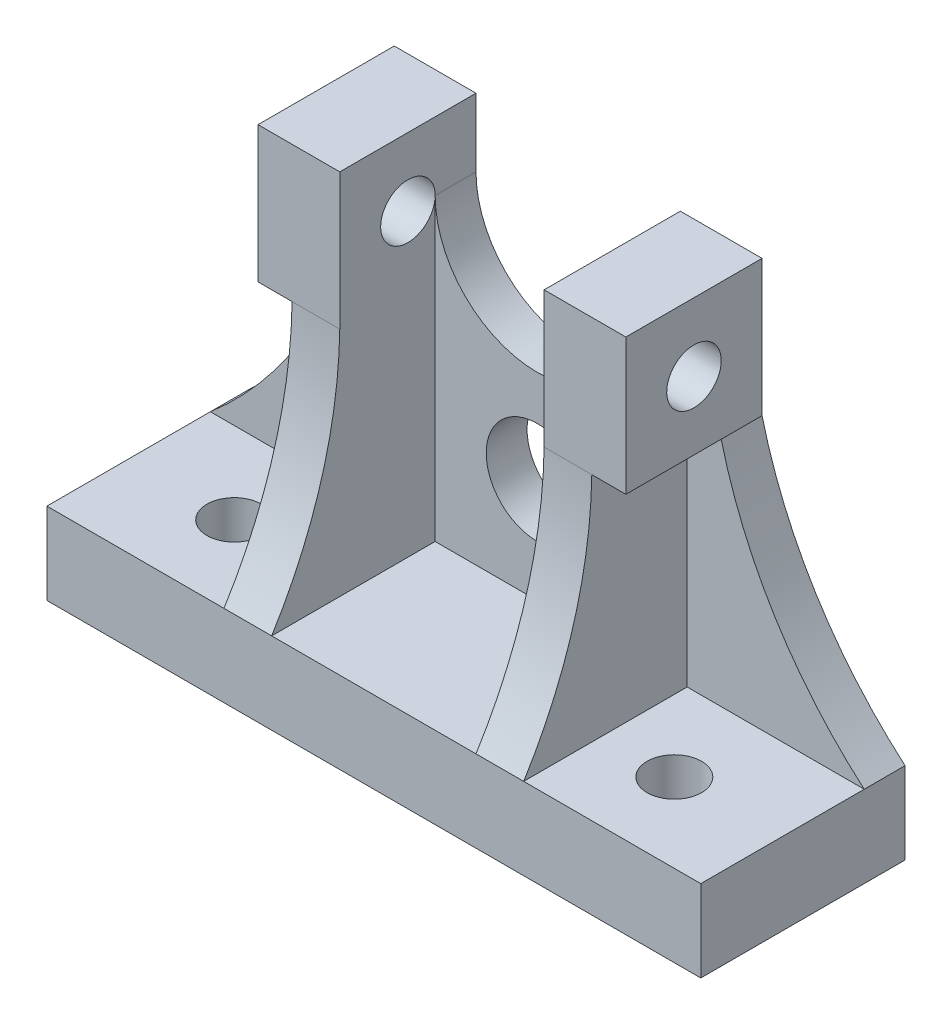
ISO-10303-21;
HEADER;
FILE_DESCRIPTION(('STEP AP214'),'2;1');
FILE_NAME('part.step','',(''),(''),'','','');
FILE_SCHEMA(('AUTOMOTIVE_DESIGN { 1 0 10303 214 1 1 1 1 }'));
ENDSEC;
DATA;
#1=APPLICATION_CONTEXT('core data for automotive mechanical design processes');
#2=APPLICATION_PROTOCOL_DEFINITION('international standard','automotive_design',2000,#1);
#3=PRODUCT_CONTEXT('',#1,'mechanical');
#4=PRODUCT('Part','Part','',(#3));
#5=PRODUCT_RELATED_PRODUCT_CATEGORY('part','',(#4));
#6=PRODUCT_DEFINITION_FORMATION('','',#4);
#7=PRODUCT_DEFINITION_CONTEXT('part definition',#1,'design');
#8=PRODUCT_DEFINITION('design','',#6,#7);
#9=PRODUCT_DEFINITION_SHAPE('','',#8);
#10=(LENGTH_UNIT() NAMED_UNIT(*) SI_UNIT(.MILLI.,.METRE.));
#11=(NAMED_UNIT(*) PLANE_ANGLE_UNIT() SI_UNIT($,.RADIAN.));
#12=(NAMED_UNIT(*) SI_UNIT($,.STERADIAN.) SOLID_ANGLE_UNIT());
#13=UNCERTAINTY_MEASURE_WITH_UNIT(LENGTH_MEASURE(1.E-05),#10,'distance_accuracy_value','');
#14=(GEOMETRIC_REPRESENTATION_CONTEXT(3) GLOBAL_UNCERTAINTY_ASSIGNED_CONTEXT((#13)) GLOBAL_UNIT_ASSIGNED_CONTEXT((#10,
#11,#12)) REPRESENTATION_CONTEXT('',''));
#15=CARTESIAN_POINT('',(0.,0.,0.));
#16=DIRECTION('',(0.,0.,1.));
#17=DIRECTION('',(1.,0.,0.));
#18=AXIS2_PLACEMENT_3D('',#15,#16,#17);
#19=CARTESIAN_POINT('',(0.,12.,30.));
#20=DIRECTION('',(0.,-1.,0.));
#21=DIRECTION('',(0.,0.,-1.));
#22=AXIS2_PLACEMENT_3D('',#19,#20,#21);
#23=PLANE('',#22);
#24=CARTESIAN_POINT('',(32.4988825502588,12.,18.3811393677707));
#25=DIRECTION('',(0.,1.,0.));
#26=DIRECTION('',(0.,0.,1.));
#27=AXIS2_PLACEMENT_3D('',#24,#25,#26);
#28=CIRCLE('',#27,3.99999999999999);
#29=CARTESIAN_POINT('',(32.4988825502588,12.,22.3811393677707));
#30=VERTEX_POINT('',#29);
#31=EDGE_CURVE('E526',#30,#30,#28,.T.);
#32=ORIENTED_EDGE('',*,*,#31,.F.);
#33=EDGE_LOOP('',(#32));
#34=FACE_BOUND('',#33,.T.);
#35=DIRECTION('',(0.,0.,-1.));
#36=VECTOR('',#35,1.);
#37=CARTESIAN_POINT('',(22.,12.,6.));
#38=LINE('',#37,#36);
#39=CARTESIAN_POINT('',(22.,12.,30.));
#40=VERTEX_POINT('',#39);
#41=CARTESIAN_POINT('',(22.,12.,6.));
#42=VERTEX_POINT('',#41);
#43=EDGE_CURVE('E69',#40,#42,#38,.T.);
#44=ORIENTED_EDGE('',*,*,#43,.F.);
#45=DIRECTION('',(-1.,0.,0.));
#46=VECTOR('',#45,1.);
#47=CARTESIAN_POINT('',(0.,12.,30.));
#48=LINE('',#47,#46);
#49=CARTESIAN_POINT('',(48.,12.,30.));
#50=VERTEX_POINT('',#49);
#51=EDGE_CURVE('E407',#50,#40,#48,.T.);
#52=ORIENTED_EDGE('',*,*,#51,.F.);
#53=DIRECTION('',(0.,0.,-1.));
#54=VECTOR('',#53,1.);
#55=CARTESIAN_POINT('',(48.,12.,30.));
#56=LINE('',#55,#54);
#57=CARTESIAN_POINT('',(48.,12.,6.));
#58=VERTEX_POINT('',#57);
#59=EDGE_CURVE('E422',#50,#58,#56,.T.);
#60=ORIENTED_EDGE('',*,*,#59,.T.);
#61=DIRECTION('',(-1.,0.,0.));
#62=VECTOR('',#61,1.);
#63=CARTESIAN_POINT('',(0.,12.,6.));
#64=LINE('',#63,#62);
#65=EDGE_CURVE('E355',#58,#42,#64,.T.);
#66=ORIENTED_EDGE('',*,*,#65,.T.);
#67=EDGE_LOOP('',(#44,#52,#60,#66));
#68=FACE_BOUND('',#67,.T.);
#69=ADVANCED_FACE('F45',(#34,#68),#23,.F.);
#70=CARTESIAN_POINT('',(0.,0.,6.));
#71=DIRECTION('',(0.,0.,1.));
#72=DIRECTION('',(1.,0.,0.));
#73=AXIS2_PLACEMENT_3D('',#70,#71,#72);
#74=PLANE('',#73);
#75=DIRECTION('',(-1.,0.,0.));
#76=VECTOR('',#75,1.);
#77=CARTESIAN_POINT('',(0.,46.,6.));
#78=LINE('',#77,#76);
#79=CARTESIAN_POINT('',(27.,46.,6.));
#80=VERTEX_POINT('',#79);
#81=CARTESIAN_POINT('',(22.,46.,6.));
#82=VERTEX_POINT('',#81);
#83=EDGE_CURVE('E363',#80,#82,#78,.T.);
#84=ORIENTED_EDGE('',*,*,#83,.T.);
#85=DIRECTION('',(0.,1.,0.));
#86=VECTOR('',#85,1.);
#87=CARTESIAN_POINT('',(22.,46.,6.));
#88=LINE('',#87,#86);
#89=EDGE_CURVE('E225',#42,#82,#88,.T.);
#90=ORIENTED_EDGE('',*,*,#89,.F.);
#91=ORIENTED_EDGE('',*,*,#65,.F.);
#92=CARTESIAN_POINT('',(91.0174934385468,62.054922417926,6.));
#93=DIRECTION('',(0.,0.,1.));
#94=DIRECTION('',(1.,0.,0.));
#95=AXIS2_PLACEMENT_3D('',#92,#93,#94);
#96=CIRCLE('',#95,66.);
#97=EDGE_CURVE('E358',#58,#80,#96,.F.);
#98=ORIENTED_EDGE('',*,*,#97,.T.);
#99=EDGE_LOOP('',(#84,#90,#91,#98));
#100=FACE_BOUND('',#99,.T.);
#101=ADVANCED_FACE('F549',(#100),#74,.T.);
#102=CARTESIAN_POINT('',(0.,46.,20.));
#103=DIRECTION('',(0.,-1.,0.));
#104=DIRECTION('',(0.,0.,-1.));
#105=AXIS2_PLACEMENT_3D('',#102,#103,#104);
#106=PLANE('',#105);
#107=DIRECTION('',(-1.,0.,0.));
#108=VECTOR('',#107,1.);
#109=CARTESIAN_POINT('',(0.,46.,20.));
#110=LINE('',#109,#108);
#111=CARTESIAN_POINT('',(27.,46.,20.));
#112=VERTEX_POINT('',#111);
#113=CARTESIAN_POINT('',(22.,46.,20.));
#114=VERTEX_POINT('',#113);
#115=EDGE_CURVE('E205',#112,#114,#110,.T.);
#116=ORIENTED_EDGE('',*,*,#115,.T.);
#117=DIRECTION('',(0.,0.,1.));
#118=VECTOR('',#117,1.);
#119=CARTESIAN_POINT('',(22.,46.,20.));
#120=LINE('',#119,#118);
#121=EDGE_CURVE('E237',#82,#114,#120,.T.);
#122=ORIENTED_EDGE('',*,*,#121,.F.);
#123=ORIENTED_EDGE('',*,*,#83,.F.);
#124=DIRECTION('',(0.,0.,-1.));
#125=VECTOR('',#124,1.);
#126=CARTESIAN_POINT('',(27.,46.,20.));
#127=LINE('',#126,#125);
#128=EDGE_CURVE('E292',#112,#80,#127,.T.);
#129=ORIENTED_EDGE('',*,*,#128,.F.);
#130=EDGE_LOOP('',(#116,#122,#123,#129));
#131=FACE_BOUND('',#130,.T.);
#132=ADVANCED_FACE('F542',(#131),#106,.T.);
#133=CARTESIAN_POINT('',(-32.5,12.,18.));
#134=DIRECTION('',(0.,1.,0.));
#135=DIRECTION('',(0.,0.,1.));
#136=AXIS2_PLACEMENT_3D('',#133,#134,#135);
#137=CIRCLE('',#136,3.99999999999999);
#138=CARTESIAN_POINT('',(-32.5,12.,22.));
#139=VERTEX_POINT('',#138);
#140=EDGE_CURVE('E534',#139,#139,#137,.T.);
#141=ORIENTED_EDGE('',*,*,#140,.F.);
#142=EDGE_LOOP('',(#141));
#143=FACE_BOUND('',#142,.T.);
#144=DIRECTION('',(0.,0.,-1.));
#145=VECTOR('',#144,1.);
#146=CARTESIAN_POINT('',(-22.,12.,6.));
#147=LINE('',#146,#145);
#148=CARTESIAN_POINT('',(-22.,12.,30.));
#149=VERTEX_POINT('',#148);
#150=CARTESIAN_POINT('',(-22.,12.,6.));
#151=VERTEX_POINT('',#150);
#152=EDGE_CURVE('E250',#149,#151,#147,.T.);
#153=ORIENTED_EDGE('',*,*,#152,.T.);
#154=CARTESIAN_POINT('',(-48.,12.,6.));
#155=VERTEX_POINT('',#154);
#156=EDGE_CURVE('E354',#151,#155,#64,.T.);
#157=ORIENTED_EDGE('',*,*,#156,.T.);
#158=DIRECTION('',(0.,0.,-1.));
#159=VECTOR('',#158,1.);
#160=CARTESIAN_POINT('',(-48.,12.,30.));
#161=LINE('',#160,#159);
#162=CARTESIAN_POINT('',(-48.,12.,30.));
#163=VERTEX_POINT('',#162);
#164=EDGE_CURVE('E11',#163,#155,#161,.T.);
#165=ORIENTED_EDGE('',*,*,#164,.F.);
#166=EDGE_CURVE('E411',#149,#163,#48,.T.);
#167=ORIENTED_EDGE('',*,*,#166,.F.);
#168=EDGE_LOOP('',(#153,#157,#165,#167));
#169=FACE_BOUND('',#168,.T.);
#170=ADVANCED_FACE('F466',(#143,#169),#23,.F.);
#171=ORIENTED_EDGE('',*,*,#156,.F.);
#172=DIRECTION('',(0.,1.,0.));
#173=VECTOR('',#172,1.);
#174=CARTESIAN_POINT('',(-22.,46.,6.));
#175=LINE('',#174,#173);
#176=CARTESIAN_POINT('',(-22.,46.,6.));
#177=VERTEX_POINT('',#176);
#178=EDGE_CURVE('E238',#151,#177,#175,.T.);
#179=ORIENTED_EDGE('',*,*,#178,.T.);
#180=DIRECTION('',(1.,0.,0.));
#181=VECTOR('',#180,1.);
#182=CARTESIAN_POINT('',(0.,46.,6.));
#183=LINE('',#182,#181);
#184=CARTESIAN_POINT('',(-27.,46.,6.));
#185=VERTEX_POINT('',#184);
#186=EDGE_CURVE('E346',#185,#177,#183,.T.);
#187=ORIENTED_EDGE('',*,*,#186,.F.);
#188=CARTESIAN_POINT('',(-91.0174934385468,62.0549224179259,6.));
#189=DIRECTION('',(0.,0.,1.));
#190=DIRECTION('',(1.,0.,0.));
#191=AXIS2_PLACEMENT_3D('',#188,#189,#190);
#192=CIRCLE('',#191,66.);
#193=EDGE_CURVE('E350',#155,#185,#192,.T.);
#194=ORIENTED_EDGE('',*,*,#193,.F.);
#195=EDGE_LOOP('',(#171,#179,#187,#194));
#196=FACE_BOUND('',#195,.T.);
#197=ADVANCED_FACE('F472',(#196),#74,.T.);
#198=CARTESIAN_POINT('',(0.,46.,20.));
#199=DIRECTION('',(0.,1.,0.));
#200=DIRECTION('',(0.,0.,1.));
#201=AXIS2_PLACEMENT_3D('',#198,#199,#200);
#202=PLANE('',#201);
#203=DIRECTION('',(0.,0.,1.));
#204=VECTOR('',#203,1.);
#205=CARTESIAN_POINT('',(-22.,46.,20.));
#206=LINE('',#205,#204);
#207=CARTESIAN_POINT('',(-22.,46.,20.));
#208=VERTEX_POINT('',#207);
#209=EDGE_CURVE('E242',#177,#208,#206,.T.);
#210=ORIENTED_EDGE('',*,*,#209,.T.);
#211=DIRECTION('',(1.,0.,0.));
#212=VECTOR('',#211,1.);
#213=CARTESIAN_POINT('',(0.,46.,20.));
#214=LINE('',#213,#212);
#215=CARTESIAN_POINT('',(-27.,46.,20.));
#216=VERTEX_POINT('',#215);
#217=EDGE_CURVE('E297',#216,#208,#214,.T.);
#218=ORIENTED_EDGE('',*,*,#217,.F.);
#219=DIRECTION('',(0.,0.,-1.));
#220=VECTOR('',#219,1.);
#221=CARTESIAN_POINT('',(-27.,46.,20.));
#222=LINE('',#221,#220);
#223=EDGE_CURVE('E312',#216,#185,#222,.T.);
#224=ORIENTED_EDGE('',*,*,#223,.T.);
#225=ORIENTED_EDGE('',*,*,#186,.T.);
#226=EDGE_LOOP('',(#210,#218,#224,#225));
#227=FACE_BOUND('',#226,.T.);
#228=ADVANCED_FACE('F547',(#227),#202,.F.);
#229=CARTESIAN_POINT('',(15.,12.,30.));
#230=VERTEX_POINT('',#229);
#231=CARTESIAN_POINT('',(-15.,12.,30.));
#232=VERTEX_POINT('',#231);
#233=EDGE_CURVE('E61',#230,#232,#48,.T.);
#234=ORIENTED_EDGE('',*,*,#233,.F.);
#235=DIRECTION('',(0.,0.,-1.));
#236=VECTOR('',#235,1.);
#237=CARTESIAN_POINT('',(15.,12.,6.));
#238=LINE('',#237,#236);
#239=CARTESIAN_POINT('',(15.,12.,6.));
#240=VERTEX_POINT('',#239);
#241=EDGE_CURVE('E223',#230,#240,#238,.T.);
#242=ORIENTED_EDGE('',*,*,#241,.T.);
#243=CARTESIAN_POINT('',(-15.,12.,6.));
#244=VERTEX_POINT('',#243);
#245=EDGE_CURVE('E359',#240,#244,#64,.T.);
#246=ORIENTED_EDGE('',*,*,#245,.T.);
#247=DIRECTION('',(0.,0.,-1.));
#248=VECTOR('',#247,1.);
#249=CARTESIAN_POINT('',(-15.,12.,6.));
#250=LINE('',#249,#248);
#251=EDGE_CURVE('E243',#232,#244,#250,.T.);
#252=ORIENTED_EDGE('',*,*,#251,.F.);
#253=EDGE_LOOP('',(#234,#242,#246,#252));
#254=FACE_BOUND('',#253,.T.);
#255=ADVANCED_FACE('F47',(#254),#23,.F.);
#256=CARTESIAN_POINT('',(-48.,0.,30.));
#257=DIRECTION('',(1.,0.,0.));
#258=DIRECTION('',(0.,0.,-1.));
#259=AXIS2_PLACEMENT_3D('',#256,#257,#258);
#260=PLANE('',#259);
#261=DIRECTION('',(0.,-1.,0.));
#262=VECTOR('',#261,1.);
#263=CARTESIAN_POINT('',(-48.,0.,0.));
#264=LINE('',#263,#262);
#265=CARTESIAN_POINT('',(-48.,12.,0.));
#266=VERTEX_POINT('',#265);
#267=CARTESIAN_POINT('',(-48.,0.,0.));
#268=VERTEX_POINT('',#267);
#269=EDGE_CURVE('E406',#266,#268,#264,.T.);
#270=ORIENTED_EDGE('',*,*,#269,.T.);
#271=DIRECTION('',(0.,0.,-1.));
#272=VECTOR('',#271,1.);
#273=CARTESIAN_POINT('',(-48.,0.,30.));
#274=LINE('',#273,#272);
#275=CARTESIAN_POINT('',(-48.,0.,30.));
#276=VERTEX_POINT('',#275);
#277=EDGE_CURVE('E54',#276,#268,#274,.T.);
#278=ORIENTED_EDGE('',*,*,#277,.F.);
#279=DIRECTION('',(0.,-1.,0.));
#280=VECTOR('',#279,1.);
#281=CARTESIAN_POINT('',(-48.,0.,30.));
#282=LINE('',#281,#280);
#283=EDGE_CURVE('E410',#163,#276,#282,.T.);
#284=ORIENTED_EDGE('',*,*,#283,.F.);
#285=ORIENTED_EDGE('',*,*,#164,.T.);
#286=DIRECTION('',(0.,0.,-1.));
#287=VECTOR('',#286,1.);
#288=CARTESIAN_POINT('',(-48.,12.,6.));
#289=LINE('',#288,#287);
#290=EDGE_CURVE('E395',#155,#266,#289,.T.);
#291=ORIENTED_EDGE('',*,*,#290,.T.);
#292=EDGE_LOOP('',(#270,#278,#284,#285,#291));
#293=FACE_BOUND('',#292,.T.);
#294=ADVANCED_FACE('F448',(#293),#260,.F.);
#295=CARTESIAN_POINT('',(0.,0.,30.));
#296=DIRECTION('',(0.,-1.,0.));
#297=DIRECTION('',(0.,0.,-1.));
#298=AXIS2_PLACEMENT_3D('',#295,#296,#297);
#299=PLANE('',#298);
#300=CARTESIAN_POINT('',(-32.5,0.,18.));
#301=DIRECTION('',(0.,1.,0.));
#302=DIRECTION('',(0.,0.,1.));
#303=AXIS2_PLACEMENT_3D('',#300,#301,#302);
#304=CIRCLE('',#303,4.);
#305=CARTESIAN_POINT('',(-32.5,0.,22.));
#306=VERTEX_POINT('',#305);
#307=EDGE_CURVE('E530',#306,#306,#304,.T.);
#308=ORIENTED_EDGE('',*,*,#307,.T.);
#309=EDGE_LOOP('',(#308));
#310=FACE_BOUND('',#309,.T.);
#311=CARTESIAN_POINT('',(32.4988825502588,0.,18.3811393677707));
#312=DIRECTION('',(0.,1.,0.));
#313=DIRECTION('',(0.,0.,1.));
#314=AXIS2_PLACEMENT_3D('',#311,#312,#313);
#315=CIRCLE('',#314,4.);
#316=CARTESIAN_POINT('',(32.4988825502588,0.,22.3811393677707));
#317=VERTEX_POINT('',#316);
#318=EDGE_CURVE('E522',#317,#317,#315,.T.);
#319=ORIENTED_EDGE('',*,*,#318,.T.);
#320=EDGE_LOOP('',(#319));
#321=FACE_BOUND('',#320,.T.);
#322=DIRECTION('',(-1.,0.,0.));
#323=VECTOR('',#322,1.);
#324=CARTESIAN_POINT('',(0.,0.,0.));
#325=LINE('',#324,#323);
#326=CARTESIAN_POINT('',(48.,0.,0.));
#327=VERTEX_POINT('',#326);
#328=EDGE_CURVE('E426',#327,#268,#325,.T.);
#329=ORIENTED_EDGE('',*,*,#328,.F.);
#330=DIRECTION('',(0.,0.,-1.));
#331=VECTOR('',#330,1.);
#332=CARTESIAN_POINT('',(48.,0.,30.));
#333=LINE('',#332,#331);
#334=CARTESIAN_POINT('',(48.,0.,30.));
#335=VERTEX_POINT('',#334);
#336=EDGE_CURVE('E437',#335,#327,#333,.T.);
#337=ORIENTED_EDGE('',*,*,#336,.F.);
#338=DIRECTION('',(-1.,0.,0.));
#339=VECTOR('',#338,1.);
#340=CARTESIAN_POINT('',(0.,0.,30.));
#341=LINE('',#340,#339);
#342=EDGE_CURVE('E414',#335,#276,#341,.T.);
#343=ORIENTED_EDGE('',*,*,#342,.T.);
#344=ORIENTED_EDGE('',*,*,#277,.T.);
#345=EDGE_LOOP('',(#329,#337,#343,#344));
#346=FACE_BOUND('',#345,.T.);
#347=ADVANCED_FACE('F443',(#310,#321,#346),#299,.T.);
#348=CARTESIAN_POINT('',(48.,0.,30.));
#349=DIRECTION('',(1.,0.,0.));
#350=DIRECTION('',(0.,0.,-1.));
#351=AXIS2_PLACEMENT_3D('',#348,#349,#350);
#352=PLANE('',#351);
#353=DIRECTION('',(0.,-1.,0.));
#354=VECTOR('',#353,1.);
#355=CARTESIAN_POINT('',(48.,0.,0.));
#356=LINE('',#355,#354);
#357=CARTESIAN_POINT('',(48.,12.,0.));
#358=VERTEX_POINT('',#357);
#359=EDGE_CURVE('E430',#358,#327,#356,.T.);
#360=ORIENTED_EDGE('',*,*,#359,.F.);
#361=DIRECTION('',(0.,0.,-1.));
#362=VECTOR('',#361,1.);
#363=CARTESIAN_POINT('',(48.,12.,6.));
#364=LINE('',#363,#362);
#365=EDGE_CURVE('E392',#58,#358,#364,.T.);
#366=ORIENTED_EDGE('',*,*,#365,.F.);
#367=ORIENTED_EDGE('',*,*,#59,.F.);
#368=DIRECTION('',(0.,-1.,0.));
#369=VECTOR('',#368,1.);
#370=CARTESIAN_POINT('',(48.,0.,30.));
#371=LINE('',#370,#369);
#372=EDGE_CURVE('E418',#50,#335,#371,.T.);
#373=ORIENTED_EDGE('',*,*,#372,.T.);
#374=ORIENTED_EDGE('',*,*,#336,.T.);
#375=EDGE_LOOP('',(#360,#366,#367,#373,#374));
#376=FACE_BOUND('',#375,.T.);
#377=ADVANCED_FACE('F458',(#376),#352,.T.);
#378=CARTESIAN_POINT('',(0.,0.,30.));
#379=DIRECTION('',(0.,0.,1.));
#380=DIRECTION('',(1.,0.,0.));
#381=AXIS2_PLACEMENT_3D('',#378,#379,#380);
#382=PLANE('',#381);
#383=ORIENTED_EDGE('',*,*,#51,.T.);
#384=DIRECTION('',(-1.,0.,0.));
#385=VECTOR('',#384,1.);
#386=CARTESIAN_POINT('',(22.,12.,30.));
#387=LINE('',#386,#385);
#388=EDGE_CURVE('E219',#40,#230,#387,.T.);
#389=ORIENTED_EDGE('',*,*,#388,.T.);
#390=ORIENTED_EDGE('',*,*,#233,.T.);
#391=DIRECTION('',(1.,0.,0.));
#392=VECTOR('',#391,1.);
#393=CARTESIAN_POINT('',(-22.,12.,30.));
#394=LINE('',#393,#392);
#395=EDGE_CURVE('E261',#149,#232,#394,.T.);
#396=ORIENTED_EDGE('',*,*,#395,.F.);
#397=ORIENTED_EDGE('',*,*,#166,.T.);
#398=ORIENTED_EDGE('',*,*,#283,.T.);
#399=ORIENTED_EDGE('',*,*,#342,.F.);
#400=ORIENTED_EDGE('',*,*,#372,.F.);
#401=EDGE_LOOP('',(#383,#389,#390,#396,#397,#398,#399,#400));
#402=FACE_BOUND('',#401,.T.);
#403=ADVANCED_FACE('F461',(#402),#382,.T.);
#404=CARTESIAN_POINT('',(0.,0.,0.));
#405=DIRECTION('',(0.,0.,1.));
#406=DIRECTION('',(1.,0.,0.));
#407=AXIS2_PLACEMENT_3D('',#404,#405,#406);
#408=PLANE('',#407);
#409=DIRECTION('',(0.,1.,0.));
#410=VECTOR('',#409,1.);
#411=CARTESIAN_POINT('',(-15.,0.,0.));
#412=LINE('',#411,#410);
#413=CARTESIAN_POINT('',(-15.,56.,0.));
#414=VERTEX_POINT('',#413);
#415=CARTESIAN_POINT('',(-15.,66.,0.));
#416=VERTEX_POINT('',#415);
#417=EDGE_CURVE('E296',#414,#416,#412,.T.);
#418=ORIENTED_EDGE('',*,*,#417,.F.);
#419=CARTESIAN_POINT('',(0.,56.,0.));
#420=DIRECTION('',(0.,0.,1.));
#421=DIRECTION('',(1.,0.,0.));
#422=AXIS2_PLACEMENT_3D('',#419,#420,#421);
#423=CIRCLE('',#422,15.);
#424=CARTESIAN_POINT('',(15.,56.,0.));
#425=VERTEX_POINT('',#424);
#426=EDGE_CURVE('E375',#414,#425,#423,.T.);
#427=ORIENTED_EDGE('',*,*,#426,.T.);
#428=DIRECTION('',(0.,1.,0.));
#429=VECTOR('',#428,1.);
#430=CARTESIAN_POINT('',(15.,0.,0.));
#431=LINE('',#430,#429);
#432=CARTESIAN_POINT('',(15.,66.,0.));
#433=VERTEX_POINT('',#432);
#434=EDGE_CURVE('E265',#425,#433,#431,.T.);
#435=ORIENTED_EDGE('',*,*,#434,.T.);
#436=DIRECTION('',(1.,0.,0.));
#437=VECTOR('',#436,1.);
#438=CARTESIAN_POINT('',(0.,66.,0.));
#439=LINE('',#438,#437);
#440=CARTESIAN_POINT('',(27.,66.,0.));
#441=VERTEX_POINT('',#440);
#442=EDGE_CURVE('E206',#433,#441,#439,.T.);
#443=ORIENTED_EDGE('',*,*,#442,.T.);
#444=DIRECTION('',(0.,-1.,0.));
#445=VECTOR('',#444,1.);
#446=CARTESIAN_POINT('',(27.,0.,0.));
#447=LINE('',#446,#445);
#448=CARTESIAN_POINT('',(27.,46.,0.));
#449=VERTEX_POINT('',#448);
#450=EDGE_CURVE('E280',#441,#449,#447,.T.);
#451=ORIENTED_EDGE('',*,*,#450,.T.);
#452=CARTESIAN_POINT('',(91.0174934385468,62.054922417926,0.));
#453=DIRECTION('',(0.,0.,1.));
#454=DIRECTION('',(1.,0.,0.));
#455=AXIS2_PLACEMENT_3D('',#452,#453,#454);
#456=CIRCLE('',#455,66.);
#457=EDGE_CURVE('E338',#358,#449,#456,.F.);
#458=ORIENTED_EDGE('',*,*,#457,.F.);
#459=ORIENTED_EDGE('',*,*,#359,.T.);
#460=ORIENTED_EDGE('',*,*,#328,.T.);
#461=ORIENTED_EDGE('',*,*,#269,.F.);
#462=CARTESIAN_POINT('',(-91.0174934385468,62.0549224179259,0.));
#463=DIRECTION('',(0.,0.,1.));
#464=DIRECTION('',(1.,0.,0.));
#465=AXIS2_PLACEMENT_3D('',#462,#463,#464);
#466=CIRCLE('',#465,66.);
#467=CARTESIAN_POINT('',(-27.,46.,0.));
#468=VERTEX_POINT('',#467);
#469=EDGE_CURVE('E379',#266,#468,#466,.T.);
#470=ORIENTED_EDGE('',*,*,#469,.T.);
#471=DIRECTION('',(0.,-1.,0.));
#472=VECTOR('',#471,1.);
#473=CARTESIAN_POINT('',(-27.,0.,0.));
#474=LINE('',#473,#472);
#475=CARTESIAN_POINT('',(-27.,66.,0.));
#476=VERTEX_POINT('',#475);
#477=EDGE_CURVE('E302',#476,#468,#474,.T.);
#478=ORIENTED_EDGE('',*,*,#477,.F.);
#479=DIRECTION('',(1.,0.,0.));
#480=VECTOR('',#479,1.);
#481=CARTESIAN_POINT('',(0.,66.,0.));
#482=LINE('',#481,#480);
#483=EDGE_CURVE('E315',#476,#416,#482,.T.);
#484=ORIENTED_EDGE('',*,*,#483,.T.);
#485=EDGE_LOOP('',(#418,#427,#435,#443,#451,#458,#459,#460,#461,#470,#478,#484));
#486=FACE_BOUND('',#485,.T.);
#487=CARTESIAN_POINT('',(0.,27.,0.));
#488=DIRECTION('',(0.,0.,1.));
#489=DIRECTION('',(1.,0.,0.));
#490=AXIS2_PLACEMENT_3D('',#487,#488,#489);
#491=CIRCLE('',#490,7.5);
#492=CARTESIAN_POINT('',(7.5,27.,0.));
#493=VERTEX_POINT('',#492);
#494=EDGE_CURVE('E332',#493,#493,#491,.T.);
#495=ORIENTED_EDGE('',*,*,#494,.T.);
#496=EDGE_LOOP('',(#495));
#497=FACE_BOUND('',#496,.T.);
#498=ADVANCED_FACE('F452',(#486,#497),#408,.F.);
#499=CARTESIAN_POINT('',(0.,56.,6.));
#500=DIRECTION('',(0.,0.,-1.));
#501=DIRECTION('',(-1.,0.,0.));
#502=AXIS2_PLACEMENT_3D('',#499,#500,#501);
#503=CYLINDRICAL_SURFACE('',#502,15.);
#504=ORIENTED_EDGE('',*,*,#426,.F.);
#505=DIRECTION('',(0.,0.,-1.));
#506=VECTOR('',#505,1.);
#507=CARTESIAN_POINT('',(-15.,56.,6.));
#508=LINE('',#507,#506);
#509=CARTESIAN_POINT('',(-15.,56.,6.));
#510=VERTEX_POINT('',#509);
#511=EDGE_CURVE('E402',#510,#414,#508,.T.);
#512=ORIENTED_EDGE('',*,*,#511,.F.);
#513=CARTESIAN_POINT('',(0.,56.,6.));
#514=DIRECTION('',(0.,0.,1.));
#515=DIRECTION('',(1.,0.,0.));
#516=AXIS2_PLACEMENT_3D('',#513,#514,#515);
#517=CIRCLE('',#516,15.);
#518=CARTESIAN_POINT('',(15.,56.,6.));
#519=VERTEX_POINT('',#518);
#520=EDGE_CURVE('E337',#510,#519,#517,.T.);
#521=ORIENTED_EDGE('',*,*,#520,.T.);
#522=DIRECTION('',(0.,0.,-1.));
#523=VECTOR('',#522,1.);
#524=CARTESIAN_POINT('',(15.,56.,6.));
#525=LINE('',#524,#523);
#526=EDGE_CURVE('E371',#519,#425,#525,.T.);
#527=ORIENTED_EDGE('',*,*,#526,.T.);
#528=EDGE_LOOP('',(#504,#512,#521,#527));
#529=FACE_BOUND('',#528,.T.);
#530=ADVANCED_FACE('F493',(#529),#503,.F.);
#531=CARTESIAN_POINT('',(-91.0174934385468,62.0549224179259,6.));
#532=DIRECTION('',(0.,0.,-1.));
#533=DIRECTION('',(-1.,0.,0.));
#534=AXIS2_PLACEMENT_3D('',#531,#532,#533);
#535=CYLINDRICAL_SURFACE('',#534,66.);
#536=ORIENTED_EDGE('',*,*,#469,.F.);
#537=ORIENTED_EDGE('',*,*,#290,.F.);
#538=ORIENTED_EDGE('',*,*,#193,.T.);
#539=DIRECTION('',(0.,0.,-1.));
#540=VECTOR('',#539,1.);
#541=CARTESIAN_POINT('',(-27.,46.,6.));
#542=LINE('',#541,#540);
#543=EDGE_CURVE('E399',#185,#468,#542,.T.);
#544=ORIENTED_EDGE('',*,*,#543,.T.);
#545=EDGE_LOOP('',(#536,#537,#538,#544));
#546=FACE_BOUND('',#545,.T.);
#547=ADVANCED_FACE('F475',(#546),#535,.F.);
#548=CARTESIAN_POINT('',(91.0174934385468,62.054922417926,6.));
#549=DIRECTION('',(0.,0.,-1.));
#550=DIRECTION('',(-1.,0.,0.));
#551=AXIS2_PLACEMENT_3D('',#548,#549,#550);
#552=CYLINDRICAL_SURFACE('',#551,66.);
#553=ORIENTED_EDGE('',*,*,#457,.T.);
#554=DIRECTION('',(0.,0.,-1.));
#555=VECTOR('',#554,1.);
#556=CARTESIAN_POINT('',(27.,46.,6.));
#557=LINE('',#556,#555);
#558=EDGE_CURVE('E389',#80,#449,#557,.T.);
#559=ORIENTED_EDGE('',*,*,#558,.F.);
#560=ORIENTED_EDGE('',*,*,#97,.F.);
#561=ORIENTED_EDGE('',*,*,#365,.T.);
#562=EDGE_LOOP('',(#553,#559,#560,#561));
#563=FACE_BOUND('',#562,.T.);
#564=ADVANCED_FACE('F620',(#563),#552,.F.);
#565=CARTESIAN_POINT('',(0.,27.,6.));
#566=DIRECTION('',(0.,0.,-1.));
#567=DIRECTION('',(-1.,0.,0.));
#568=AXIS2_PLACEMENT_3D('',#565,#566,#567);
#569=CYLINDRICAL_SURFACE('',#568,7.5);
#570=CARTESIAN_POINT('',(0.,27.,6.));
#571=DIRECTION('',(0.,0.,1.));
#572=DIRECTION('',(1.,0.,0.));
#573=AXIS2_PLACEMENT_3D('',#570,#571,#572);
#574=CIRCLE('',#573,7.5);
#575=CARTESIAN_POINT('',(7.5,27.,6.));
#576=VERTEX_POINT('',#575);
#577=EDGE_CURVE('E333',#576,#576,#574,.T.);
#578=ORIENTED_EDGE('',*,*,#577,.T.);
#579=EDGE_LOOP('',(#578));
#580=FACE_BOUND('',#579,.T.);
#581=ORIENTED_EDGE('',*,*,#494,.F.);
#582=EDGE_LOOP('',(#581));
#583=FACE_BOUND('',#582,.T.);
#584=ADVANCED_FACE('F619',(#580,#583),#569,.F.);
#585=ORIENTED_EDGE('',*,*,#245,.F.);
#586=DIRECTION('',(0.,1.,0.));
#587=VECTOR('',#586,1.);
#588=CARTESIAN_POINT('',(15.,0.,6.));
#589=LINE('',#588,#587);
#590=EDGE_CURVE('E367',#240,#519,#589,.T.);
#591=ORIENTED_EDGE('',*,*,#590,.T.);
#592=ORIENTED_EDGE('',*,*,#520,.F.);
#593=DIRECTION('',(0.,1.,0.));
#594=VECTOR('',#593,1.);
#595=CARTESIAN_POINT('',(-15.,0.,6.));
#596=LINE('',#595,#594);
#597=EDGE_CURVE('E342',#244,#510,#596,.T.);
#598=ORIENTED_EDGE('',*,*,#597,.F.);
#599=EDGE_LOOP('',(#585,#591,#592,#598));
#600=FACE_BOUND('',#599,.T.);
#601=ORIENTED_EDGE('',*,*,#577,.F.);
#602=EDGE_LOOP('',(#601));
#603=FACE_BOUND('',#602,.T.);
#604=ADVANCED_FACE('F497',(#600,#603),#74,.T.);
#605=CARTESIAN_POINT('',(-15.,0.,20.));
#606=DIRECTION('',(-1.,0.,0.));
#607=DIRECTION('',(0.,0.,1.));
#608=AXIS2_PLACEMENT_3D('',#605,#606,#607);
#609=PLANE('',#608);
#610=ORIENTED_EDGE('',*,*,#597,.T.);
#611=CARTESIAN_POINT('',(-15.,56.,10.));
#612=DIRECTION('',(-1.,0.,0.));
#613=DIRECTION('',(0.,0.,1.));
#614=AXIS2_PLACEMENT_3D('',#611,#612,#613);
#615=CIRCLE('',#614,3.99999999999999);
#616=EDGE_CURVE('E231',#510,#510,#615,.T.);
#617=ORIENTED_EDGE('',*,*,#616,.T.);
#618=ORIENTED_EDGE('',*,*,#511,.T.);
#619=ORIENTED_EDGE('',*,*,#417,.T.);
#620=DIRECTION('',(0.,0.,-1.));
#621=VECTOR('',#620,1.);
#622=CARTESIAN_POINT('',(-15.,66.,20.));
#623=LINE('',#622,#621);
#624=CARTESIAN_POINT('',(-15.,66.,20.));
#625=VERTEX_POINT('',#624);
#626=EDGE_CURVE('E328',#625,#416,#623,.T.);
#627=ORIENTED_EDGE('',*,*,#626,.F.);
#628=DIRECTION('',(0.,1.,0.));
#629=VECTOR('',#628,1.);
#630=CARTESIAN_POINT('',(-15.,0.,20.));
#631=LINE('',#630,#629);
#632=CARTESIAN_POINT('',(-15.,46.,20.));
#633=VERTEX_POINT('',#632);
#634=EDGE_CURVE('E301',#633,#625,#631,.T.);
#635=ORIENTED_EDGE('',*,*,#634,.F.);
#636=CARTESIAN_POINT('',(-15.,46.9392108696064,85.9933169566617));
#637=DIRECTION('',(-1.,0.,0.));
#638=DIRECTION('',(0.,0.,-1.));
#639=AXIS2_PLACEMENT_3D('',#636,#637,#638);
#640=CIRCLE('',#639,66.);
#641=EDGE_CURVE('E218',#633,#232,#640,.T.);
#642=ORIENTED_EDGE('',*,*,#641,.T.);
#643=ORIENTED_EDGE('',*,*,#251,.T.);
#644=EDGE_LOOP('',(#610,#617,#618,#619,#627,#635,#642,#643));
#645=FACE_BOUND('',#644,.T.);
#646=ADVANCED_FACE('F487',(#645),#609,.F.);
#647=CARTESIAN_POINT('',(0.,66.,20.));
#648=DIRECTION('',(0.,1.,0.));
#649=DIRECTION('',(0.,0.,1.));
#650=AXIS2_PLACEMENT_3D('',#647,#648,#649);
#651=PLANE('',#650);
#652=ORIENTED_EDGE('',*,*,#483,.F.);
#653=DIRECTION('',(0.,0.,-1.));
#654=VECTOR('',#653,1.);
#655=CARTESIAN_POINT('',(-27.,66.,20.));
#656=LINE('',#655,#654);
#657=CARTESIAN_POINT('',(-27.,66.,20.));
#658=VERTEX_POINT('',#657);
#659=EDGE_CURVE('E325',#658,#476,#656,.T.);
#660=ORIENTED_EDGE('',*,*,#659,.F.);
#661=DIRECTION('',(1.,0.,0.));
#662=VECTOR('',#661,1.);
#663=CARTESIAN_POINT('',(0.,66.,20.));
#664=LINE('',#663,#662);
#665=EDGE_CURVE('E305',#658,#625,#664,.T.);
#666=ORIENTED_EDGE('',*,*,#665,.T.);
#667=ORIENTED_EDGE('',*,*,#626,.T.);
#668=EDGE_LOOP('',(#652,#660,#666,#667));
#669=FACE_BOUND('',#668,.T.);
#670=ADVANCED_FACE('F484',(#669),#651,.T.);
#671=CARTESIAN_POINT('',(-27.,0.,20.));
#672=DIRECTION('',(1.,0.,0.));
#673=DIRECTION('',(0.,1.,0.));
#674=AXIS2_PLACEMENT_3D('',#671,#672,#673);
#675=PLANE('',#674);
#676=CARTESIAN_POINT('',(-27.,56.,10.));
#677=DIRECTION('',(-1.,0.,0.));
#678=DIRECTION('',(0.,0.,1.));
#679=AXIS2_PLACEMENT_3D('',#676,#677,#678);
#680=CIRCLE('',#679,4.);
#681=CARTESIAN_POINT('',(-27.,56.,14.));
#682=VERTEX_POINT('',#681);
#683=EDGE_CURVE('E518',#682,#682,#680,.T.);
#684=ORIENTED_EDGE('',*,*,#683,.F.);
#685=EDGE_LOOP('',(#684));
#686=FACE_BOUND('',#685,.T.);
#687=ORIENTED_EDGE('',*,*,#477,.T.);
#688=ORIENTED_EDGE('',*,*,#543,.F.);
#689=ORIENTED_EDGE('',*,*,#223,.F.);
#690=DIRECTION('',(0.,-1.,0.));
#691=VECTOR('',#690,1.);
#692=CARTESIAN_POINT('',(-27.,0.,20.));
#693=LINE('',#692,#691);
#694=EDGE_CURVE('E309',#658,#216,#693,.T.);
#695=ORIENTED_EDGE('',*,*,#694,.F.);
#696=ORIENTED_EDGE('',*,*,#659,.T.);
#697=EDGE_LOOP('',(#687,#688,#689,#695,#696));
#698=FACE_BOUND('',#697,.T.);
#699=ADVANCED_FACE('F479',(#686,#698),#675,.F.);
#700=CARTESIAN_POINT('',(0.,0.,20.));
#701=DIRECTION('',(0.,0.,1.));
#702=DIRECTION('',(1.,0.,0.));
#703=AXIS2_PLACEMENT_3D('',#700,#701,#702);
#704=PLANE('',#703);
#705=ORIENTED_EDGE('',*,*,#217,.T.);
#706=DIRECTION('',(1.,0.,0.));
#707=VECTOR('',#706,1.);
#708=CARTESIAN_POINT('',(-22.,46.,20.));
#709=LINE('',#708,#707);
#710=EDGE_CURVE('E254',#208,#633,#709,.T.);
#711=ORIENTED_EDGE('',*,*,#710,.T.);
#712=ORIENTED_EDGE('',*,*,#634,.T.);
#713=ORIENTED_EDGE('',*,*,#665,.F.);
#714=ORIENTED_EDGE('',*,*,#694,.T.);
#715=EDGE_LOOP('',(#705,#711,#712,#713,#714));
#716=FACE_BOUND('',#715,.T.);
#717=ADVANCED_FACE('F604',(#716),#704,.T.);
#718=CARTESIAN_POINT('',(15.,0.,20.));
#719=DIRECTION('',(-1.,0.,0.));
#720=DIRECTION('',(0.,0.,1.));
#721=AXIS2_PLACEMENT_3D('',#718,#719,#720);
#722=PLANE('',#721);
#723=ORIENTED_EDGE('',*,*,#526,.F.);
#724=CARTESIAN_POINT('',(15.,56.,10.));
#725=DIRECTION('',(-1.,0.,0.));
#726=DIRECTION('',(0.,0.,1.));
#727=AXIS2_PLACEMENT_3D('',#724,#725,#726);
#728=CIRCLE('',#727,3.99999999999999);
#729=EDGE_CURVE('E500',#519,#519,#728,.T.);
#730=ORIENTED_EDGE('',*,*,#729,.F.);
#731=ORIENTED_EDGE('',*,*,#590,.F.);
#732=ORIENTED_EDGE('',*,*,#241,.F.);
#733=CARTESIAN_POINT('',(15.,46.9392108696064,85.9933169566617));
#734=DIRECTION('',(-1.,0.,0.));
#735=DIRECTION('',(0.,0.,-1.));
#736=AXIS2_PLACEMENT_3D('',#733,#734,#735);
#737=CIRCLE('',#736,66.);
#738=CARTESIAN_POINT('',(15.,46.,20.));
#739=VERTEX_POINT('',#738);
#740=EDGE_CURVE('E213',#739,#230,#737,.T.);
#741=ORIENTED_EDGE('',*,*,#740,.F.);
#742=DIRECTION('',(0.,1.,0.));
#743=VECTOR('',#742,1.);
#744=CARTESIAN_POINT('',(15.,0.,20.));
#745=LINE('',#744,#743);
#746=CARTESIAN_POINT('',(15.,66.,20.));
#747=VERTEX_POINT('',#746);
#748=EDGE_CURVE('E192',#739,#747,#745,.T.);
#749=ORIENTED_EDGE('',*,*,#748,.T.);
#750=DIRECTION('',(0.,0.,-1.));
#751=VECTOR('',#750,1.);
#752=CARTESIAN_POINT('',(15.,66.,20.));
#753=LINE('',#752,#751);
#754=EDGE_CURVE('E277',#747,#433,#753,.T.);
#755=ORIENTED_EDGE('',*,*,#754,.T.);
#756=ORIENTED_EDGE('',*,*,#434,.F.);
#757=EDGE_LOOP('',(#723,#730,#731,#732,#741,#749,#755,#756));
#758=FACE_BOUND('',#757,.T.);
#759=ADVANCED_FACE('F222',(#758),#722,.T.);
#760=CARTESIAN_POINT('',(27.,0.,20.));
#761=DIRECTION('',(1.,0.,0.));
#762=DIRECTION('',(0.,1.,0.));
#763=AXIS2_PLACEMENT_3D('',#760,#761,#762);
#764=PLANE('',#763);
#765=CARTESIAN_POINT('',(27.,56.,10.));
#766=DIRECTION('',(1.,0.,0.));
#767=DIRECTION('',(0.,1.,0.));
#768=AXIS2_PLACEMENT_3D('',#765,#766,#767);
#769=CIRCLE('',#768,3.99999999999999);
#770=CARTESIAN_POINT('',(27.,60.,10.));
#771=VERTEX_POINT('',#770);
#772=EDGE_CURVE('E512',#771,#771,#769,.T.);
#773=ORIENTED_EDGE('',*,*,#772,.F.);
#774=EDGE_LOOP('',(#773));
#775=FACE_BOUND('',#774,.T.);
#776=ORIENTED_EDGE('',*,*,#450,.F.);
#777=DIRECTION('',(0.,0.,-1.));
#778=VECTOR('',#777,1.);
#779=CARTESIAN_POINT('',(27.,66.,20.));
#780=LINE('',#779,#778);
#781=CARTESIAN_POINT('',(27.,66.,20.));
#782=VERTEX_POINT('',#781);
#783=EDGE_CURVE('E289',#782,#441,#780,.T.);
#784=ORIENTED_EDGE('',*,*,#783,.F.);
#785=DIRECTION('',(0.,-1.,0.));
#786=VECTOR('',#785,1.);
#787=CARTESIAN_POINT('',(27.,0.,20.));
#788=LINE('',#787,#786);
#789=EDGE_CURVE('E271',#782,#112,#788,.T.);
#790=ORIENTED_EDGE('',*,*,#789,.T.);
#791=ORIENTED_EDGE('',*,*,#128,.T.);
#792=ORIENTED_EDGE('',*,*,#558,.T.);
#793=EDGE_LOOP('',(#776,#784,#790,#791,#792));
#794=FACE_BOUND('',#793,.T.);
#795=ADVANCED_FACE('F597',(#775,#794),#764,.T.);
#796=CARTESIAN_POINT('',(0.,66.,20.));
#797=DIRECTION('',(0.,1.,0.));
#798=DIRECTION('',(0.,0.,1.));
#799=AXIS2_PLACEMENT_3D('',#796,#797,#798);
#800=PLANE('',#799);
#801=ORIENTED_EDGE('',*,*,#442,.F.);
#802=ORIENTED_EDGE('',*,*,#754,.F.);
#803=DIRECTION('',(1.,0.,0.));
#804=VECTOR('',#803,1.);
#805=CARTESIAN_POINT('',(0.,66.,20.));
#806=LINE('',#805,#804);
#807=EDGE_CURVE('E200',#747,#782,#806,.T.);
#808=ORIENTED_EDGE('',*,*,#807,.T.);
#809=ORIENTED_EDGE('',*,*,#783,.T.);
#810=EDGE_LOOP('',(#801,#802,#808,#809));
#811=FACE_BOUND('',#810,.T.);
#812=ADVANCED_FACE('F594',(#811),#800,.T.);
#813=CARTESIAN_POINT('',(0.,0.,20.));
#814=DIRECTION('',(0.,0.,1.));
#815=DIRECTION('',(1.,0.,0.));
#816=AXIS2_PLACEMENT_3D('',#813,#814,#815);
#817=PLANE('',#816);
#818=ORIENTED_EDGE('',*,*,#748,.F.);
#819=DIRECTION('',(-1.,0.,0.));
#820=VECTOR('',#819,1.);
#821=CARTESIAN_POINT('',(22.,46.,20.));
#822=LINE('',#821,#820);
#823=EDGE_CURVE('E196',#114,#739,#822,.T.);
#824=ORIENTED_EDGE('',*,*,#823,.F.);
#825=ORIENTED_EDGE('',*,*,#115,.F.);
#826=ORIENTED_EDGE('',*,*,#789,.F.);
#827=ORIENTED_EDGE('',*,*,#807,.F.);
#828=EDGE_LOOP('',(#818,#824,#825,#826,#827));
#829=FACE_BOUND('',#828,.T.);
#830=ADVANCED_FACE('F194',(#829),#817,.T.);
#831=CARTESIAN_POINT('',(-22.,46.9392108696064,85.9933169566617));
#832=DIRECTION('',(1.,0.,0.));
#833=DIRECTION('',(0.,0.,-1.));
#834=AXIS2_PLACEMENT_3D('',#831,#832,#833);
#835=CYLINDRICAL_SURFACE('',#834,66.);
#836=ORIENTED_EDGE('',*,*,#641,.F.);
#837=ORIENTED_EDGE('',*,*,#710,.F.);
#838=CARTESIAN_POINT('',(-22.,46.9392108696064,85.9933169566617));
#839=DIRECTION('',(-1.,0.,0.));
#840=DIRECTION('',(0.,0.,-1.));
#841=AXIS2_PLACEMENT_3D('',#838,#839,#840);
#842=CIRCLE('',#841,66.);
#843=EDGE_CURVE('E247',#208,#149,#842,.T.);
#844=ORIENTED_EDGE('',*,*,#843,.T.);
#845=ORIENTED_EDGE('',*,*,#395,.T.);
#846=EDGE_LOOP('',(#836,#837,#844,#845));
#847=FACE_BOUND('',#846,.T.);
#848=ADVANCED_FACE('F587',(#847),#835,.F.);
#849=CARTESIAN_POINT('',(-22.,46.9392108696064,85.9933169566617));
#850=DIRECTION('',(1.,0.,0.));
#851=DIRECTION('',(0.,0.,-1.));
#852=AXIS2_PLACEMENT_3D('',#849,#850,#851);
#853=PLANE('',#852);
#854=ORIENTED_EDGE('',*,*,#178,.F.);
#855=ORIENTED_EDGE('',*,*,#152,.F.);
#856=ORIENTED_EDGE('',*,*,#843,.F.);
#857=ORIENTED_EDGE('',*,*,#209,.F.);
#858=EDGE_LOOP('',(#854,#855,#856,#857));
#859=FACE_BOUND('',#858,.T.);
#860=ADVANCED_FACE('F584',(#859),#853,.F.);
#861=CARTESIAN_POINT('',(22.,46.9392108696064,85.9933169566617));
#862=DIRECTION('',(-1.,0.,0.));
#863=DIRECTION('',(0.,0.,1.));
#864=AXIS2_PLACEMENT_3D('',#861,#862,#863);
#865=CYLINDRICAL_SURFACE('',#864,66.);
#866=ORIENTED_EDGE('',*,*,#740,.T.);
#867=ORIENTED_EDGE('',*,*,#388,.F.);
#868=CARTESIAN_POINT('',(22.,46.9392108696064,85.9933169566617));
#869=DIRECTION('',(-1.,0.,0.));
#870=DIRECTION('',(0.,0.,-1.));
#871=AXIS2_PLACEMENT_3D('',#868,#869,#870);
#872=CIRCLE('',#871,66.);
#873=EDGE_CURVE('E216',#114,#40,#872,.T.);
#874=ORIENTED_EDGE('',*,*,#873,.F.);
#875=ORIENTED_EDGE('',*,*,#823,.T.);
#876=EDGE_LOOP('',(#866,#867,#874,#875));
#877=FACE_BOUND('',#876,.T.);
#878=ADVANCED_FACE('F211',(#877),#865,.F.);
#879=CARTESIAN_POINT('',(22.,46.9392108696064,85.9933169566617));
#880=DIRECTION('',(-1.,0.,0.));
#881=DIRECTION('',(0.,0.,-1.));
#882=AXIS2_PLACEMENT_3D('',#879,#880,#881);
#883=PLANE('',#882);
#884=ORIENTED_EDGE('',*,*,#89,.T.);
#885=ORIENTED_EDGE('',*,*,#121,.T.);
#886=ORIENTED_EDGE('',*,*,#873,.T.);
#887=ORIENTED_EDGE('',*,*,#43,.T.);
#888=EDGE_LOOP('',(#884,#885,#886,#887));
#889=FACE_BOUND('',#888,.T.);
#890=ADVANCED_FACE('F578',(#889),#883,.F.);
#891=CARTESIAN_POINT('',(-27.,56.,10.));
#892=DIRECTION('',(-1.,0.,0.));
#893=DIRECTION('',(0.,0.,1.));
#894=AXIS2_PLACEMENT_3D('',#891,#892,#893);
#895=CYLINDRICAL_SURFACE('',#894,3.99999999999999);
#896=ORIENTED_EDGE('',*,*,#772,.T.);
#897=EDGE_LOOP('',(#896));
#898=FACE_BOUND('',#897,.T.);
#899=ORIENTED_EDGE('',*,*,#729,.T.);
#900=EDGE_LOOP('',(#899));
#901=FACE_BOUND('',#900,.T.);
#902=ADVANCED_FACE('F572',(#898,#901),#895,.F.);
#903=ORIENTED_EDGE('',*,*,#683,.T.);
#904=EDGE_LOOP('',(#903));
#905=FACE_BOUND('',#904,.T.);
#906=ORIENTED_EDGE('',*,*,#616,.F.);
#907=EDGE_LOOP('',(#906));
#908=FACE_BOUND('',#907,.T.);
#909=ADVANCED_FACE('F563',(#905,#908),#895,.F.);
#910=CARTESIAN_POINT('',(32.4988825502588,12.,18.3811393677707));
#911=DIRECTION('',(0.,1.,0.));
#912=DIRECTION('',(0.,0.,1.));
#913=AXIS2_PLACEMENT_3D('',#910,#911,#912);
#914=CYLINDRICAL_SURFACE('',#913,3.99999999999999);
#915=ORIENTED_EDGE('',*,*,#318,.F.);
#916=EDGE_LOOP('',(#915));
#917=FACE_BOUND('',#916,.T.);
#918=ORIENTED_EDGE('',*,*,#31,.T.);
#919=EDGE_LOOP('',(#918));
#920=FACE_BOUND('',#919,.T.);
#921=ADVANCED_FACE('F561',(#917,#920),#914,.F.);
#922=CARTESIAN_POINT('',(-32.5,12.,18.));
#923=DIRECTION('',(0.,1.,0.));
#924=DIRECTION('',(0.,0.,1.));
#925=AXIS2_PLACEMENT_3D('',#922,#923,#924);
#926=CYLINDRICAL_SURFACE('',#925,3.99999999999999);
#927=ORIENTED_EDGE('',*,*,#307,.F.);
#928=EDGE_LOOP('',(#927));
#929=FACE_BOUND('',#928,.T.);
#930=ORIENTED_EDGE('',*,*,#140,.T.);
#931=EDGE_LOOP('',(#930));
#932=FACE_BOUND('',#931,.T.);
#933=ADVANCED_FACE('F539',(#929,#932),#926,.F.);
#934=CLOSED_SHELL('',(#69,#101,#132,#170,#197,#228,#255,#294,#347,#377,#403,#498,#530,#547,#564,
#584,#604,#646,#670,#699,#717,#759,#795,#812,#830,#848,#860,#878,#890,#902,#909,#921,#933));
#935=MANIFOLD_SOLID_BREP('B2',#934);
#936=ADVANCED_BREP_SHAPE_REPRESENTATION('',(#18,#935),#14);
#937=SHAPE_DEFINITION_REPRESENTATION(#9,#936);
ENDSEC;
END-ISO-10303-21;
